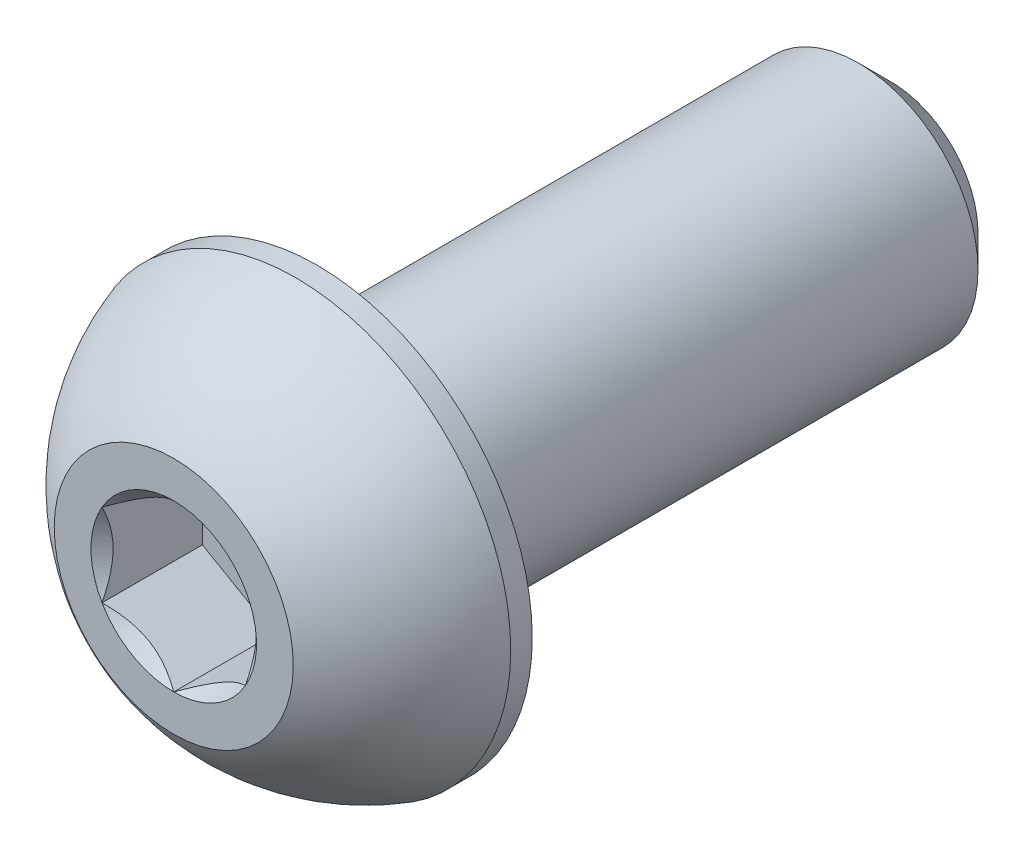
ISO-10303-21;
HEADER;
FILE_DESCRIPTION(('STEP AP214'),'2;1');
FILE_NAME('part.step','',(''),(''),'','','');
FILE_SCHEMA(('AUTOMOTIVE_DESIGN { 1 0 10303 214 1 1 1 1 }'));
ENDSEC;
DATA;
#1=APPLICATION_CONTEXT('core data for automotive mechanical design processes');
#2=APPLICATION_PROTOCOL_DEFINITION('international standard','automotive_design',2000,#1);
#3=PRODUCT_CONTEXT('',#1,'mechanical');
#4=PRODUCT('Part','Part','',(#3));
#5=PRODUCT_RELATED_PRODUCT_CATEGORY('part','',(#4));
#6=PRODUCT_DEFINITION_FORMATION('','',#4);
#7=PRODUCT_DEFINITION_CONTEXT('part definition',#1,'design');
#8=PRODUCT_DEFINITION('design','',#6,#7);
#9=PRODUCT_DEFINITION_SHAPE('','',#8);
#10=(LENGTH_UNIT() NAMED_UNIT(*) SI_UNIT(.MILLI.,.METRE.));
#11=(NAMED_UNIT(*) PLANE_ANGLE_UNIT() SI_UNIT($,.RADIAN.));
#12=(NAMED_UNIT(*) SI_UNIT($,.STERADIAN.) SOLID_ANGLE_UNIT());
#13=UNCERTAINTY_MEASURE_WITH_UNIT(LENGTH_MEASURE(1.E-05),#10,'distance_accuracy_value','');
#14=(GEOMETRIC_REPRESENTATION_CONTEXT(3) GLOBAL_UNCERTAINTY_ASSIGNED_CONTEXT((#13)) GLOBAL_UNIT_ASSIGNED_CONTEXT((#10,
#11,#12)) REPRESENTATION_CONTEXT('',''));
#15=CARTESIAN_POINT('',(0.,0.,0.));
#16=DIRECTION('',(0.,0.,1.));
#17=DIRECTION('',(1.,0.,0.));
#18=AXIS2_PLACEMENT_3D('',#15,#16,#17);
#19=CARTESIAN_POINT('',(0.,0.,-3.));
#20=DIRECTION('',(0.,0.,1.));
#21=DIRECTION('',(0.,-1.,0.));
#22=AXIS2_PLACEMENT_3D('',#19,#20,#21);
#23=PLANE('',#22);
#24=CARTESIAN_POINT('',(0.,0.,-3.));
#25=DIRECTION('',(0.,0.,1.));
#26=DIRECTION('',(0.,-1.,0.));
#27=AXIS2_PLACEMENT_3D('',#24,#25,#26);
#28=CIRCLE('',#27,0.912499999999999);
#29=CARTESIAN_POINT('',(0.,-0.9125,-3.));
#30=VERTEX_POINT('',#29);
#31=EDGE_CURVE('E54',#30,#30,#28,.T.);
#32=ORIENTED_EDGE('',*,*,#31,.F.);
#33=EDGE_LOOP('',(#32));
#34=FACE_BOUND('',#33,.T.);
#35=ADVANCED_FACE('F41',(#34),#23,.F.);
#36=CARTESIAN_POINT('',(0.,0.,-3.));
#37=DIRECTION('',(0.,0.,1.));
#38=DIRECTION('',(0.,-1.,0.));
#39=AXIS2_PLACEMENT_3D('',#36,#37,#38);
#40=CONICAL_SURFACE('',#39,0.912499999999999,0.785398163397446);
#41=CARTESIAN_POINT('',(0.,0.,-2.6625));
#42=DIRECTION('',(0.,0.,1.));
#43=DIRECTION('',(0.,-1.,0.));
#44=AXIS2_PLACEMENT_3D('',#41,#42,#43);
#45=CIRCLE('',#44,1.25);
#46=CARTESIAN_POINT('',(0.,-1.25,-2.6625));
#47=VERTEX_POINT('',#46);
#48=EDGE_CURVE('E185',#47,#47,#45,.T.);
#49=ORIENTED_EDGE('',*,*,#48,.F.);
#50=EDGE_LOOP('',(#49));
#51=FACE_BOUND('',#50,.T.);
#52=ORIENTED_EDGE('',*,*,#31,.T.);
#53=EDGE_LOOP('',(#52));
#54=FACE_BOUND('',#53,.T.);
#55=ADVANCED_FACE('F190',(#51,#54),#40,.T.);
#56=CARTESIAN_POINT('',(0.,0.,4.5));
#57=DIRECTION('',(0.,0.,1.));
#58=DIRECTION('',(0.,-1.,0.));
#59=AXIS2_PLACEMENT_3D('',#56,#57,#58);
#60=CYLINDRICAL_SURFACE('',#59,1.25);
#61=CARTESIAN_POINT('',(0.,0.,3.));
#62=DIRECTION('',(0.,0.,1.));
#63=DIRECTION('',(0.,-1.,0.));
#64=AXIS2_PLACEMENT_3D('',#61,#62,#63);
#65=CIRCLE('',#64,1.25);
#66=CARTESIAN_POINT('',(0.,-1.25,3.));
#67=VERTEX_POINT('',#66);
#68=EDGE_CURVE('E182',#67,#67,#65,.T.);
#69=ORIENTED_EDGE('',*,*,#68,.F.);
#70=EDGE_LOOP('',(#69));
#71=FACE_BOUND('',#70,.T.);
#72=ORIENTED_EDGE('',*,*,#48,.T.);
#73=EDGE_LOOP('',(#72));
#74=FACE_BOUND('',#73,.T.);
#75=ADVANCED_FACE('F196',(#71,#74),#60,.T.);
#76=CARTESIAN_POINT('',(0.,-2.25,3.));
#77=DIRECTION('',(0.,0.,1.));
#78=DIRECTION('',(0.,-1.,0.));
#79=AXIS2_PLACEMENT_3D('',#76,#77,#78);
#80=PLANE('',#79);
#81=CARTESIAN_POINT('',(0.,0.,3.));
#82=DIRECTION('',(0.,0.,1.));
#83=DIRECTION('',(0.,-1.,0.));
#84=AXIS2_PLACEMENT_3D('',#81,#82,#83);
#85=CIRCLE('',#84,2.25);
#86=CARTESIAN_POINT('',(0.,-2.25,3.));
#87=VERTEX_POINT('',#86);
#88=EDGE_CURVE('E176',#87,#87,#85,.T.);
#89=ORIENTED_EDGE('',*,*,#88,.F.);
#90=EDGE_LOOP('',(#89));
#91=FACE_BOUND('',#90,.T.);
#92=ORIENTED_EDGE('',*,*,#68,.T.);
#93=EDGE_LOOP('',(#92));
#94=FACE_BOUND('',#93,.T.);
#95=ADVANCED_FACE('F201',(#91,#94),#80,.F.);
#96=CARTESIAN_POINT('',(0.,0.,2.48995098039216));
#97=DIRECTION('',(0.,0.,1.));
#98=DIRECTION('',(0.,-1.,0.));
#99=AXIS2_PLACEMENT_3D('',#96,#97,#98);
#100=SPHERICAL_SURFACE('',#99,2.36702282651149);
#101=CARTESIAN_POINT('',(0.,0.,4.5));
#102=DIRECTION('',(0.,0.,1.));
#103=DIRECTION('',(0.,-1.,0.));
#104=AXIS2_PLACEMENT_3D('',#101,#102,#103);
#105=CIRCLE('',#104,1.25);
#106=CARTESIAN_POINT('',(0.,-1.25,4.5));
#107=VERTEX_POINT('',#106);
#108=EDGE_CURVE('E179',#107,#107,#105,.T.);
#109=CARTESIAN_POINT('',(0.,0.,3.225));
#110=DIRECTION('',(0.,0.,1.));
#111=DIRECTION('',(0.,-1.,0.));
#112=AXIS2_PLACEMENT_3D('',#109,#110,#111);
#113=CIRCLE('',#112,2.25);
#114=CARTESIAN_POINT('',(0.,-2.25,3.225));
#115=VERTEX_POINT('',#114);
#116=EDGE_CURVE('E173',#115,#115,#113,.T.);
#117=CARTESIAN_POINT('',(0.,-1.25,4.5));
#118=CARTESIAN_POINT('',(0.,-1.26462917100962,4.49090251661049));
#119=CARTESIAN_POINT('',(0.,-1.27915898996254,4.48164527352318));
#120=CARTESIAN_POINT('',(0.,-1.30801307458842,4.46281579935833));
#121=CARTESIAN_POINT('',(0.,-1.32233734026139,4.45324356828078));
#122=CARTESIAN_POINT('',(0.,-1.35077346916084,4.43378864954077));
#123=CARTESIAN_POINT('',(0.,-1.36488533238733,4.4239059618783));
#124=CARTESIAN_POINT('',(0.,-1.39288993473665,4.40383484960456));
#125=CARTESIAN_POINT('',(0.,-1.40678267385948,4.39364642499327));
#126=CARTESIAN_POINT('',(0.,-1.43434240376681,4.37296869342377));
#127=CARTESIAN_POINT('',(0.,-1.44800939455129,4.36247938646554));
#128=CARTESIAN_POINT('',(0.,-1.47511111304782,4.34120489112507));
#129=CARTESIAN_POINT('',(0.,-1.48854584075986,4.33041970274282));
#130=CARTESIAN_POINT('',(0.,-1.51517662859343,4.30855858575153));
#131=CARTESIAN_POINT('',(0.,-1.52837268871496,4.29748265714249));
#132=CARTESIAN_POINT('',(0.,-1.55451985075898,4.27504533969981));
#133=CARTESIAN_POINT('',(0.,-1.56747095268147,4.26368395086616));
#134=CARTESIAN_POINT('',(0.,-1.59312202445558,4.24068112900137));
#135=CARTESIAN_POINT('',(0.,-1.60582199430721,4.22903969597022));
#136=CARTESIAN_POINT('',(0.,-1.6309647477936,4.2054823352511));
#137=CARTESIAN_POINT('',(0.,-1.64340753142836,4.19356640756313));
#138=CARTESIAN_POINT('',(0.,-1.66802998093452,4.16946573792022));
#139=CARTESIAN_POINT('',(0.,-1.68020964680593,4.15728099596527));
#140=CARTESIAN_POINT('',(0.,-1.70430005466935,4.13264850632462));
#141=CARTESIAN_POINT('',(0.,-1.71621079666137,4.12020075863892));
#142=CARTESIAN_POINT('',(0.,-1.73975767884732,4.09504819144901));
#143=CARTESIAN_POINT('',(0.,-1.75139381904126,4.0823433719448));
#144=CARTESIAN_POINT('',(0.,-1.77438595061668,4.05668271757783));
#145=CARTESIAN_POINT('',(0.,-1.78574194199815,4.04372688271506));
#146=CARTESIAN_POINT('',(0.,-1.80816836248277,4.01757037375133));
#147=CARTESIAN_POINT('',(0.,-1.81923879158591,4.00436969965038));
#148=CARTESIAN_POINT('',(0.,-1.84108881017717,3.97772980504691));
#149=CARTESIAN_POINT('',(0.,-1.85186839966529,3.9642905845444));
#150=CARTESIAN_POINT('',(0.,-1.87313160033471,3.93718000369089));
#151=CARTESIAN_POINT('',(0.,-1.88361521151601,3.9235086433399));
#152=CARTESIAN_POINT('',(0.,-1.90428145797454,3.89594030000488));
#153=CARTESIAN_POINT('',(0.,-1.91446409325177,3.88204331702085));
#154=CARTESIAN_POINT('',(0.,-1.93452353378186,3.85403035319083));
#155=CARTESIAN_POINT('',(0.,-1.94440033903471,3.83991437234483));
#156=CARTESIAN_POINT('',(0.,-1.96384341118664,3.81147014195944));
#157=CARTESIAN_POINT('',(0.,-1.97340967808572,3.79714189242005));
#158=CARTESIAN_POINT('',(0.,-1.99222711323609,3.76827995500615));
#159=CARTESIAN_POINT('',(0.,-2.00147828148738,3.75374626713164));
#160=CARTESIAN_POINT('',(0.,-2.01966110925757,3.72448038133943));
#161=CARTESIAN_POINT('',(0.,-2.02859276877647,3.70974818342174));
#162=CARTESIAN_POINT('',(0.,-2.04613232130859,3.68009230046584));
#163=CARTESIAN_POINT('',(0.,-2.0547402143218,3.66516861542764));
#164=CARTESIAN_POINT('',(0.,-2.07162813041181,3.63513687243686));
#165=CARTESIAN_POINT('',(0.,-2.0799081534886,3.62002881448427));
#166=CARTESIAN_POINT('',(0.,-2.09613638256798,3.58963552776085));
#167=CARTESIAN_POINT('',(0.,-2.10408458857057,3.57435029899003));
#168=CARTESIAN_POINT('',(0.,-2.11964539455964,3.54360995719053));
#169=CARTESIAN_POINT('',(0.,-2.12725799454612,3.52815484416185));
#170=CARTESIAN_POINT('',(0.,-2.14214395948377,3.49708210136983));
#171=CARTESIAN_POINT('',(0.,-2.14941732443493,3.4814644716065));
#172=CARTESIAN_POINT('',(0.,-2.16362135223167,3.45007414042306));
#173=CARTESIAN_POINT('',(0.,-2.17055201507725,3.43430143900295));
#174=CARTESIAN_POINT('',(0.,-2.18406733408852,3.40260848320124));
#175=CARTESIAN_POINT('',(0.,-2.19065199025422,3.38668822881965));
#176=CARTESIAN_POINT('',(0.,-2.20347215952944,3.3547077572721));
#177=CARTESIAN_POINT('',(0.,-2.20970767263897,3.33864754010615));
#178=CARTESIAN_POINT('',(0.,-2.2218265737175,3.30639479562423));
#179=CARTESIAN_POINT('',(0.,-2.2277099616865,3.29020226830828));
#180=CARTESIAN_POINT('',(0.,-2.23912184359131,3.2576926351465));
#181=CARTESIAN_POINT('',(0.,-2.24465033752712,3.24137552930068));
#182=CARTESIAN_POINT('',(0.,-2.25,3.225));
#183=B_SPLINE_CURVE_WITH_KNOTS('',3,(#117,#118,#119,#120,#121,#122,#123,#124,#125,#126,#127,
#128,#129,#130,#131,#132,#133,#134,#135,#136,#137,#138,#139,#140,#141,#142,#143,#144,#145,#146,
#147,#148,#149,#150,#151,#152,#153,#154,#155,#156,#157,#158,#159,#160,#161,#162,#163,#164,#165,
#166,#167,#168,#169,#170,#171,#172,#173,#174,#175,#176,#177,#178,#179,#180,#181,#182),
.UNSPECIFIED.,.F.,.F.,(4,2,2,2,2,2,2,2,2,2,2,2,2,2,2,2,2,2,2,2,2,2,2,2,2,2,2,2,2,2,2,2,4),(0.,
0.0516806087027549,0.10336121740551,0.155041826108264,0.206722434811019,0.258403043513774,
0.310083652216529,0.361764260919283,0.413444869622038,0.465125478324793,0.516806087027547,
0.568486695730302,0.620167304433057,0.671847913135812,0.723528521838566,0.775209130541321,
0.826889739244076,0.87857034794683,0.930250956649585,0.981931565352339,1.03361217405509,
1.08529278275785,1.1369733914606,1.18865400016336,1.24033460886611,1.29201521756887,
1.34369582627162,1.39537643497438,1.44705704367713,1.49873765237989,1.55041826108264,
1.6020988697854,1.65377947848815),.UNSPECIFIED.);
#184=EDGE_CURVE('BSEAM206',#107,#115,#183,.T.);
#185=ORIENTED_EDGE('',*,*,#108,.F.);
#186=ORIENTED_EDGE('',*,*,#116,.T.);
#187=ORIENTED_EDGE('',*,*,#184,.T.);
#188=ORIENTED_EDGE('',*,*,#184,.F.);
#189=EDGE_LOOP('',(#185,#187,#186,#188));
#190=FACE_BOUND('',#189,.T.);
#191=ADVANCED_FACE('F206',(#190),#100,.T.);
#192=CARTESIAN_POINT('',(0.,-1.25,4.5));
#193=DIRECTION('',(0.,0.,-1.));
#194=DIRECTION('',(0.,1.,0.));
#195=AXIS2_PLACEMENT_3D('',#192,#193,#194);
#196=PLANE('',#195);
#197=CARTESIAN_POINT('',(0.,0.,4.5));
#198=DIRECTION('',(0.,0.,1.));
#199=DIRECTION('',(1.,0.,0.));
#200=AXIS2_PLACEMENT_3D('',#197,#198,#199);
#201=CIRCLE('',#200,0.866025403784438);
#202=CARTESIAN_POINT('',(0.,0.866025403784437,4.5));
#203=VERTEX_POINT('',#202);
#204=CARTESIAN_POINT('',(-0.75,0.433012701892217,4.5));
#205=VERTEX_POINT('',#204);
#206=EDGE_CURVE('E140',#203,#205,#201,.T.);
#207=ORIENTED_EDGE('',*,*,#206,.F.);
#208=CARTESIAN_POINT('',(0.75,0.433012701892218,4.5));
#209=VERTEX_POINT('',#208);
#210=EDGE_CURVE('E137',#209,#203,#201,.T.);
#211=ORIENTED_EDGE('',*,*,#210,.F.);
#212=CARTESIAN_POINT('',(0.75,-0.43301270189222,4.5));
#213=VERTEX_POINT('',#212);
#214=EDGE_CURVE('E107',#213,#209,#201,.T.);
#215=ORIENTED_EDGE('',*,*,#214,.F.);
#216=CARTESIAN_POINT('',(0.,-0.866025403784439,4.5));
#217=VERTEX_POINT('',#216);
#218=EDGE_CURVE('E99',#217,#213,#201,.T.);
#219=ORIENTED_EDGE('',*,*,#218,.F.);
#220=CARTESIAN_POINT('',(-0.749999999999999,-0.43301270189222,4.5));
#221=VERTEX_POINT('',#220);
#222=EDGE_CURVE('E60',#221,#217,#201,.T.);
#223=ORIENTED_EDGE('',*,*,#222,.F.);
#224=EDGE_CURVE('E67',#205,#221,#201,.T.);
#225=ORIENTED_EDGE('',*,*,#224,.F.);
#226=EDGE_LOOP('',(#207,#211,#215,#219,#223,#225));
#227=FACE_BOUND('',#226,.T.);
#228=ORIENTED_EDGE('',*,*,#108,.T.);
#229=EDGE_LOOP('',(#228));
#230=FACE_BOUND('',#229,.T.);
#231=ADVANCED_FACE('F134',(#227,#230),#196,.F.);
#232=CARTESIAN_POINT('',(0.,0.,4.5));
#233=DIRECTION('',(0.,0.,1.));
#234=DIRECTION('',(0.,-1.,0.));
#235=AXIS2_PLACEMENT_3D('',#232,#233,#234);
#236=CYLINDRICAL_SURFACE('',#235,2.25);
#237=ORIENTED_EDGE('',*,*,#116,.F.);
#238=EDGE_LOOP('',(#237));
#239=FACE_BOUND('',#238,.T.);
#240=ORIENTED_EDGE('',*,*,#88,.T.);
#241=EDGE_LOOP('',(#240));
#242=FACE_BOUND('',#241,.T.);
#243=ADVANCED_FACE('F212',(#239,#242),#236,.T.);
#244=CARTESIAN_POINT('',(0.,0.,4.5));
#245=DIRECTION('',(0.,0.,1.));
#246=DIRECTION('',(1.,0.,0.));
#247=AXIS2_PLACEMENT_3D('',#244,#245,#246);
#248=CONICAL_SURFACE('',#247,0.866025403784438,0.78539816339745);
#249=ORIENTED_EDGE('',*,*,#214,.T.);
#250=CARTESIAN_POINT('',(0.75,-0.863604064848464,4.7777892581354));
#251=CARTESIAN_POINT('',(0.75,-0.842575879734334,4.76191493200841));
#252=CARTESIAN_POINT('',(0.75,-0.821430496291562,4.746196265183));
#253=CARTESIAN_POINT('',(0.75,-0.77885785741902,4.71513452062663));
#254=CARTESIAN_POINT('',(0.75,-0.757430533042237,4.69979153749355));
#255=CARTESIAN_POINT('',(0.75,-0.692340710712937,4.65420358029367));
#256=CARTESIAN_POINT('',(0.75,-0.648190081053414,4.62464409174343));
#257=CARTESIAN_POINT('',(0.75,-0.55560718150175,4.5666155826928));
#258=CARTESIAN_POINT('',(0.75,-0.507074363017997,4.5383051093658));
#259=CARTESIAN_POINT('',(0.75,-0.407587529772338,4.48651811176889));
#260=CARTESIAN_POINT('',(0.75,-0.356642419548471,4.46302529153185));
#261=CARTESIAN_POINT('',(0.75,-0.280165468820771,4.43428689950068));
#262=CARTESIAN_POINT('',(0.75,-0.255770023930572,4.42603927481306));
#263=CARTESIAN_POINT('',(0.75,-0.206403277885132,4.41149717542019));
#264=CARTESIAN_POINT('',(0.75,-0.181431937185907,4.40520283526912));
#265=CARTESIAN_POINT('',(0.75,-0.106699879404925,4.3899931738806));
#266=CARTESIAN_POINT('',(0.75,-0.0561907171762179,4.3843771847129));
#267=CARTESIAN_POINT('',(0.75,0.0430767231749057,4.38362825645435));
#268=CARTESIAN_POINT('',(0.75,0.0918322434166279,4.38812345140561));
#269=CARTESIAN_POINT('',(0.75,0.164112195698294,4.40133730744598));
#270=CARTESIAN_POINT('',(0.75,0.188278676879436,4.40690144638208));
#271=CARTESIAN_POINT('',(0.75,0.23609448012033,4.41992316614873));
#272=CARTESIAN_POINT('',(0.75,0.25974384527304,4.42738058854766));
#273=CARTESIAN_POINT('',(0.75,0.334198278463818,4.45366646946609));
#274=CARTESIAN_POINT('',(0.75,0.383940060445494,4.47549033804845));
#275=CARTESIAN_POINT('',(0.75,0.481089225076665,4.52401180410059));
#276=CARTESIAN_POINT('',(0.75,0.528487417973016,4.55072691131035));
#277=CARTESIAN_POINT('',(0.75,0.619071540465249,4.60584285115078));
#278=CARTESIAN_POINT('',(0.75,0.662349745300237,4.63409394545219));
#279=CARTESIAN_POINT('',(0.75,0.726111623216223,4.6777671470975));
#280=CARTESIAN_POINT('',(0.75,0.747090419255278,4.6924788605167));
#281=CARTESIAN_POINT('',(0.75,0.788761341501859,4.7222913841024));
#282=CARTESIAN_POINT('',(0.75,0.809453544535618,4.73739208676303));
#283=CARTESIAN_POINT('',(0.75,0.830026390097468,4.75265408930473));
#284=B_SPLINE_CURVE_WITH_KNOTS('',3,(#250,#251,#252,#253,#254,#255,#256,#257,#258,#259,#260,
#261,#262,#263,#264,#265,#266,#267,#268,#269,#270,#271,#272,#273,#274,#275,#276,#277,#278,#279,
#280,#281,#282,#283),.UNSPECIFIED.,.F.,.F.,(4,2,2,2,2,2,2,2,2,2,2,2,2,2,2,2,4),(0.,
0.0790398443124677,0.158099390497593,0.317425208674102,0.485845155681378,0.653685658303958,
0.730869805636066,0.808059268704009,0.959469653380781,1.10540290447489,1.17973203111653,
1.25405493988072,1.41653726506054,1.57961304287543,1.73458511695816,1.81145152932467,
1.88829692115811),.UNSPECIFIED.);
#285=EDGE_CURVE('E11',#213,#209,#284,.T.);
#286=ORIENTED_EDGE('',*,*,#285,.F.);
#287=EDGE_LOOP('',(#249,#286));
#288=FACE_BOUND('',#287,.T.);
#289=ADVANCED_FACE('F111',(#288),#248,.F.);
#290=ORIENTED_EDGE('',*,*,#210,.T.);
#291=CARTESIAN_POINT('',(0.7502,0.43289723183838,4.50011549314477));
#292=CARTESIAN_POINT('',(0.724410037442318,0.447787073663448,4.48523411046392));
#293=CARTESIAN_POINT('',(0.69818879787134,0.462925913388237,4.47122626560696));
#294=CARTESIAN_POINT('',(0.644720291764293,0.493795969782308,4.44557752468226));
#295=CARTESIAN_POINT('',(0.617467932539427,0.509530126716837,4.43395091170567));
#296=CARTESIAN_POINT('',(0.562514649618646,0.541257419404003,4.41403404577224));
#297=CARTESIAN_POINT('',(0.53482774330449,0.557242462217509,4.40569369408137));
#298=CARTESIAN_POINT('',(0.478844404869146,0.589564457733289,4.39284274196143));
#299=CARTESIAN_POINT('',(0.450549685156354,0.605900421776114,4.38832254058884));
#300=CARTESIAN_POINT('',(0.401789710731156,0.634052006136182,4.38424583309744));
#301=CARTESIAN_POINT('',(0.381387934344427,0.645830977225007,4.38364279661408));
#302=CARTESIAN_POINT('',(0.34062386530364,0.66936612345897,4.38465450601553));
#303=CARTESIAN_POINT('',(0.320261582348545,0.681122293004409,4.38626974099003));
#304=CARTESIAN_POINT('',(0.259465456913176,0.716222952390205,4.39433614697304));
#305=CARTESIAN_POINT('',(0.219334145003901,0.739392776123958,4.40400893582772));
#306=CARTESIAN_POINT('',(0.148889599645974,0.780063953349298,4.42735631797231));
#307=CARTESIAN_POINT('',(0.118246427990914,0.797755796753171,4.43980855807225));
#308=CARTESIAN_POINT('',(0.0581606541952102,0.832446334428587,4.46785961023086));
#309=CARTESIAN_POINT('',(0.0287145116184091,0.8494470727719,4.48344818590375));
#310=CARTESIAN_POINT('',(-0.000200000000000146,0.866140873838275,4.50011549314477));
#311=B_SPLINE_CURVE_WITH_KNOTS('',3,(#291,#292,#293,#294,#295,#296,#297,#298,#299,#300,#301,
#302,#303,#304,#305,#306,#307,#308,#309,#310),.UNSPECIFIED.,.F.,.F.,(4,2,2,2,2,2,2,2,2,4),(0.,
0.0999419466095595,0.200466857654446,0.299393763705718,0.39807129730023,0.468665775681748,
0.539275821398839,0.680536257244566,0.792918418368073,0.904939568716031),.UNSPECIFIED.);
#312=EDGE_CURVE('E139',#209,#203,#311,.T.);
#313=ORIENTED_EDGE('',*,*,#312,.F.);
#314=EDGE_LOOP('',(#290,#313));
#315=FACE_BOUND('',#314,.T.);
#316=ADVANCED_FACE('F291',(#315),#248,.F.);
#317=ORIENTED_EDGE('',*,*,#206,.T.);
#318=CARTESIAN_POINT('',(0.000200000000000006,0.866140873838275,4.50011549314477));
#319=CARTESIAN_POINT('',(-0.0255899625576814,0.851251032013207,4.48523411046392));
#320=CARTESIAN_POINT('',(-0.051811202128659,0.836112192288417,4.47122626560696));
#321=CARTESIAN_POINT('',(-0.105279708235706,0.805242135894346,4.44557752468226));
#322=CARTESIAN_POINT('',(-0.132532067460573,0.789507978959817,4.43395091170567));
#323=CARTESIAN_POINT('',(-0.187485350381353,0.757780686272651,4.41403404577224));
#324=CARTESIAN_POINT('',(-0.215172256695509,0.741795643459145,4.40569369408137));
#325=CARTESIAN_POINT('',(-0.271155595130853,0.709473647943366,4.39284274196143));
#326=CARTESIAN_POINT('',(-0.299450314843645,0.69313768390054,4.38832254058884));
#327=CARTESIAN_POINT('',(-0.348210289268843,0.664986099540472,4.38424583309744));
#328=CARTESIAN_POINT('',(-0.368612065655572,0.653207128451648,4.38364279661408));
#329=CARTESIAN_POINT('',(-0.40937613469636,0.629671982217685,4.38465450601553));
#330=CARTESIAN_POINT('',(-0.429738417651455,0.617915812672245,4.38626974099003));
#331=CARTESIAN_POINT('',(-0.490534543086823,0.582815153286449,4.39433614697304));
#332=CARTESIAN_POINT('',(-0.530665854996099,0.559645329552696,4.40400893582772));
#333=CARTESIAN_POINT('',(-0.601110400354025,0.518974152327356,4.42735631797231));
#334=CARTESIAN_POINT('',(-0.631753572009086,0.501282308923483,4.43980855807225));
#335=CARTESIAN_POINT('',(-0.691839345804789,0.466591771248067,4.46785961023086));
#336=CARTESIAN_POINT('',(-0.72128548838159,0.449591032904755,4.48344818590375));
#337=CARTESIAN_POINT('',(-0.750199999999999,0.43289723183838,4.50011549314477));
#338=B_SPLINE_CURVE_WITH_KNOTS('',3,(#318,#319,#320,#321,#322,#323,#324,#325,#326,#327,#328,
#329,#330,#331,#332,#333,#334,#335,#336,#337),.UNSPECIFIED.,.F.,.F.,(4,2,2,2,2,2,2,2,2,4),(0.,
0.0999419466095594,0.200466857654446,0.299393763705717,0.39807129730023,0.468665775681748,
0.539275821398839,0.680536257244566,0.792918418368073,0.904939568716031),.UNSPECIFIED.);
#339=EDGE_CURVE('E143',#203,#205,#338,.T.);
#340=ORIENTED_EDGE('',*,*,#339,.F.);
#341=EDGE_LOOP('',(#317,#340));
#342=FACE_BOUND('',#341,.T.);
#343=ADVANCED_FACE('F146',(#342),#248,.F.);
#344=ORIENTED_EDGE('',*,*,#224,.T.);
#345=CARTESIAN_POINT('',(-0.749999999999999,-0.863604064848464,4.7777892581354));
#346=CARTESIAN_POINT('',(-0.749999999999999,-0.842575879734334,4.76191493200841));
#347=CARTESIAN_POINT('',(-0.749999999999999,-0.821430496291562,4.746196265183));
#348=CARTESIAN_POINT('',(-0.749999999999999,-0.778857857419021,4.71513452062663));
#349=CARTESIAN_POINT('',(-0.749999999999999,-0.757430533042238,4.69979153749355));
#350=CARTESIAN_POINT('',(-0.749999999999999,-0.692340710712937,4.65420358029367));
#351=CARTESIAN_POINT('',(-0.749999999999999,-0.648190081053414,4.62464409174343));
#352=CARTESIAN_POINT('',(-0.749999999999999,-0.555607181501751,4.5666155826928));
#353=CARTESIAN_POINT('',(-0.749999999999999,-0.507074363017997,4.53830510936579));
#354=CARTESIAN_POINT('',(-0.749999999999999,-0.407587529772338,4.48651811176889));
#355=CARTESIAN_POINT('',(-0.749999999999999,-0.356642419548472,4.46302529153185));
#356=CARTESIAN_POINT('',(-0.749999999999999,-0.280165468820772,4.43428689950068));
#357=CARTESIAN_POINT('',(-0.749999999999999,-0.255770023930573,4.42603927481306));
#358=CARTESIAN_POINT('',(-0.749999999999999,-0.206403277885132,4.41149717542019));
#359=CARTESIAN_POINT('',(-0.749999999999999,-0.181431937185908,4.40520283526912));
#360=CARTESIAN_POINT('',(-0.749999999999999,-0.106699879404925,4.3899931738806));
#361=CARTESIAN_POINT('',(-0.749999999999999,-0.0561907171762184,4.3843771847129));
#362=CARTESIAN_POINT('',(-0.749999999999999,0.0430767231749052,4.38362825645435));
#363=CARTESIAN_POINT('',(-0.749999999999999,0.0918322434166273,4.38812345140561));
#364=CARTESIAN_POINT('',(-0.749999999999999,0.164112195698293,4.40133730744598));
#365=CARTESIAN_POINT('',(-0.749999999999999,0.188278676879436,4.40690144638208));
#366=CARTESIAN_POINT('',(-0.749999999999999,0.23609448012033,4.41992316614873));
#367=CARTESIAN_POINT('',(-0.749999999999999,0.25974384527304,4.42738058854766));
#368=CARTESIAN_POINT('',(-0.749999999999999,0.334198278463818,4.45366646946609));
#369=CARTESIAN_POINT('',(-0.749999999999999,0.383940060445494,4.47549033804844));
#370=CARTESIAN_POINT('',(-0.749999999999999,0.481089225076664,4.52401180410059));
#371=CARTESIAN_POINT('',(-0.749999999999999,0.528487417973015,4.55072691131035));
#372=CARTESIAN_POINT('',(-0.749999999999999,0.619071540465249,4.60584285115078));
#373=CARTESIAN_POINT('',(-0.749999999999999,0.662349745300237,4.63409394545219));
#374=CARTESIAN_POINT('',(-0.749999999999999,0.726111623216223,4.6777671470975));
#375=CARTESIAN_POINT('',(-0.749999999999999,0.747090419255278,4.6924788605167));
#376=CARTESIAN_POINT('',(-0.749999999999999,0.788761341501858,4.7222913841024));
#377=CARTESIAN_POINT('',(-0.749999999999999,0.809453544535618,4.73739208676303));
#378=CARTESIAN_POINT('',(-0.749999999999999,0.830026390097467,4.75265408930473));
#379=B_SPLINE_CURVE_WITH_KNOTS('',3,(#345,#346,#347,#348,#349,#350,#351,#352,#353,#354,#355,
#356,#357,#358,#359,#360,#361,#362,#363,#364,#365,#366,#367,#368,#369,#370,#371,#372,#373,#374,
#375,#376,#377,#378),.UNSPECIFIED.,.F.,.F.,(4,2,2,2,2,2,2,2,2,2,2,2,2,2,2,2,4),(0.,
0.0790398443124676,0.158099390497593,0.317425208674102,0.485845155681378,0.653685658303958,
0.730869805636066,0.808059268704009,0.959469653380781,1.10540290447489,1.17973203111653,
1.25405493988072,1.41653726506054,1.57961304287543,1.73458511695816,1.81145152932467,
1.8882969211581),.UNSPECIFIED.);
#380=EDGE_CURVE('E149',#205,#221,#379,.F.);
#381=ORIENTED_EDGE('',*,*,#380,.F.);
#382=EDGE_LOOP('',(#344,#381));
#383=FACE_BOUND('',#382,.T.);
#384=ADVANCED_FACE('F150',(#383),#248,.F.);
#385=ORIENTED_EDGE('',*,*,#222,.T.);
#386=CARTESIAN_POINT('',(-0.750199999999999,-0.432897231838383,4.50011549314477));
#387=CARTESIAN_POINT('',(-0.724410037442318,-0.44778707366345,4.48523411046393));
#388=CARTESIAN_POINT('',(-0.69818879787134,-0.46292591338824,4.47122626560696));
#389=CARTESIAN_POINT('',(-0.644720291764293,-0.493795969782311,4.44557752468226));
#390=CARTESIAN_POINT('',(-0.617467932539427,-0.50953012671684,4.43395091170567));
#391=CARTESIAN_POINT('',(-0.562514649618647,-0.541257419404006,4.41403404577225));
#392=CARTESIAN_POINT('',(-0.534827743304491,-0.557242462217512,4.40569369408137));
#393=CARTESIAN_POINT('',(-0.478844404869147,-0.589564457733291,4.39284274196143));
#394=CARTESIAN_POINT('',(-0.450549685156355,-0.605900421776117,4.38832254058884));
#395=CARTESIAN_POINT('',(-0.401789710731157,-0.634052006136184,4.38424583309744));
#396=CARTESIAN_POINT('',(-0.381387934344428,-0.645830977225009,4.38364279661408));
#397=CARTESIAN_POINT('',(-0.34062386530364,-0.669366123458972,4.38465450601553));
#398=CARTESIAN_POINT('',(-0.320261582348545,-0.681122293004412,4.38626974099004));
#399=CARTESIAN_POINT('',(-0.259465456913177,-0.716222952390208,4.39433614697304));
#400=CARTESIAN_POINT('',(-0.219334145003901,-0.739392776123961,4.40400893582772));
#401=CARTESIAN_POINT('',(-0.148889599645975,-0.780063953349301,4.42735631797232));
#402=CARTESIAN_POINT('',(-0.118246427990914,-0.797755796753174,4.43980855807225));
#403=CARTESIAN_POINT('',(-0.0581606541952105,-0.83244633442859,4.46785961023086));
#404=CARTESIAN_POINT('',(-0.0287145116184095,-0.849447072771902,4.48344818590375));
#405=CARTESIAN_POINT('',(0.000199999999999996,-0.866140873838277,4.50011549314477));
#406=B_SPLINE_CURVE_WITH_KNOTS('',3,(#386,#387,#388,#389,#390,#391,#392,#393,#394,#395,#396,
#397,#398,#399,#400,#401,#402,#403,#404,#405),.UNSPECIFIED.,.F.,.F.,(4,2,2,2,2,2,2,2,2,4),(0.,
0.0999419466095591,0.200466857654446,0.299393763705716,0.398071297300229,0.468665775681746,
0.539275821398838,0.680536257244565,0.792918418368073,0.904939568716031),.UNSPECIFIED.);
#407=EDGE_CURVE('E123',#221,#217,#406,.T.);
#408=ORIENTED_EDGE('',*,*,#407,.F.);
#409=EDGE_LOOP('',(#385,#408));
#410=FACE_BOUND('',#409,.T.);
#411=ADVANCED_FACE('F240',(#410),#248,.F.);
#412=ORIENTED_EDGE('',*,*,#218,.T.);
#413=CARTESIAN_POINT('',(-0.00020000000000007,-0.866140873838277,4.50011549314477));
#414=CARTESIAN_POINT('',(0.0255899625576813,-0.85125103201321,4.48523411046393));
#415=CARTESIAN_POINT('',(0.051811202128659,-0.83611219228842,4.47122626560696));
#416=CARTESIAN_POINT('',(0.105279708235706,-0.805242135894349,4.44557752468226));
#417=CARTESIAN_POINT('',(0.132532067460572,-0.78950797895982,4.43395091170567));
#418=CARTESIAN_POINT('',(0.187485350381353,-0.757780686272654,4.41403404577225));
#419=CARTESIAN_POINT('',(0.215172256695509,-0.741795643459148,4.40569369408137));
#420=CARTESIAN_POINT('',(0.271155595130853,-0.709473647943369,4.39284274196143));
#421=CARTESIAN_POINT('',(0.299450314843644,-0.693137683900543,4.38832254058884));
#422=CARTESIAN_POINT('',(0.348210289268843,-0.664986099540476,4.38424583309744));
#423=CARTESIAN_POINT('',(0.368612065655572,-0.653207128451651,4.38364279661408));
#424=CARTESIAN_POINT('',(0.409376134696359,-0.629671982217688,4.38465450601553));
#425=CARTESIAN_POINT('',(0.429738417651454,-0.617915812672248,4.38626974099004));
#426=CARTESIAN_POINT('',(0.490534543086823,-0.582815153286452,4.39433614697304));
#427=CARTESIAN_POINT('',(0.530665854996098,-0.559645329552699,4.40400893582772));
#428=CARTESIAN_POINT('',(0.601110400354025,-0.518974152327359,4.42735631797232));
#429=CARTESIAN_POINT('',(0.631753572009086,-0.501282308923486,4.43980855807225));
#430=CARTESIAN_POINT('',(0.691839345804789,-0.46659177124807,4.46785961023086));
#431=CARTESIAN_POINT('',(0.72128548838159,-0.449591032904758,4.48344818590375));
#432=CARTESIAN_POINT('',(0.7502,-0.432897231838383,4.50011549314477));
#433=B_SPLINE_CURVE_WITH_KNOTS('',3,(#413,#414,#415,#416,#417,#418,#419,#420,#421,#422,#423,
#424,#425,#426,#427,#428,#429,#430,#431,#432),.UNSPECIFIED.,.F.,.F.,(4,2,2,2,2,2,2,2,2,4),(0.,
0.0999419466095594,0.200466857654446,0.299393763705717,0.398071297300229,0.468665775681747,
0.539275821398838,0.680536257244565,0.792918418368073,0.904939568716031),.UNSPECIFIED.);
#434=EDGE_CURVE('E103',#217,#213,#433,.T.);
#435=ORIENTED_EDGE('',*,*,#434,.F.);
#436=EDGE_LOOP('',(#412,#435));
#437=FACE_BOUND('',#436,.T.);
#438=ADVANCED_FACE('F101',(#437),#248,.F.);
#439=CARTESIAN_POINT('',(0.75,-0.43301270189222,3.45));
#440=DIRECTION('',(0.,0.,1.));
#441=DIRECTION('',(1.,0.,0.));
#442=AXIS2_PLACEMENT_3D('',#439,#440,#441);
#443=PLANE('',#442);
#444=DIRECTION('',(0.866025403784439,0.5,0.));
#445=VECTOR('',#444,1.);
#446=CARTESIAN_POINT('',(0.,-0.866025403784439,3.45));
#447=LINE('',#446,#445);
#448=CARTESIAN_POINT('',(0.,-0.866025403784439,3.45));
#449=VERTEX_POINT('',#448);
#450=CARTESIAN_POINT('',(0.75,-0.43301270189222,3.45));
#451=VERTEX_POINT('',#450);
#452=EDGE_CURVE('E122',#449,#451,#447,.T.);
#453=ORIENTED_EDGE('',*,*,#452,.T.);
#454=DIRECTION('',(0.,1.,0.));
#455=VECTOR('',#454,1.);
#456=CARTESIAN_POINT('',(0.75,-0.43301270189222,3.45));
#457=LINE('',#456,#455);
#458=CARTESIAN_POINT('',(0.75,0.433012701892218,3.45));
#459=VERTEX_POINT('',#458);
#460=EDGE_CURVE('E127',#451,#459,#457,.T.);
#461=ORIENTED_EDGE('',*,*,#460,.T.);
#462=DIRECTION('',(-0.866025403784439,0.5,0.));
#463=VECTOR('',#462,1.);
#464=CARTESIAN_POINT('',(0.75,0.433012701892218,3.45));
#465=LINE('',#464,#463);
#466=CARTESIAN_POINT('',(0.,0.866025403784437,3.45));
#467=VERTEX_POINT('',#466);
#468=EDGE_CURVE('E274',#459,#467,#465,.T.);
#469=ORIENTED_EDGE('',*,*,#468,.T.);
#470=DIRECTION('',(-0.866025403784439,-0.5,0.));
#471=VECTOR('',#470,1.);
#472=CARTESIAN_POINT('',(0.,0.866025403784437,3.45));
#473=LINE('',#472,#471);
#474=CARTESIAN_POINT('',(-0.749999999999999,0.433012701892218,3.45));
#475=VERTEX_POINT('',#474);
#476=EDGE_CURVE('E276',#467,#475,#473,.T.);
#477=ORIENTED_EDGE('',*,*,#476,.T.);
#478=DIRECTION('',(0.,-1.,0.));
#479=VECTOR('',#478,1.);
#480=CARTESIAN_POINT('',(-0.749999999999999,0.433012701892218,3.45));
#481=LINE('',#480,#479);
#482=CARTESIAN_POINT('',(-0.749999999999999,-0.433012701892221,3.45));
#483=VERTEX_POINT('',#482);
#484=EDGE_CURVE('E164',#475,#483,#481,.T.);
#485=ORIENTED_EDGE('',*,*,#484,.T.);
#486=DIRECTION('',(0.866025403784439,-0.5,0.));
#487=VECTOR('',#486,1.);
#488=CARTESIAN_POINT('',(-0.749999999999999,-0.433012701892221,3.45));
#489=LINE('',#488,#487);
#490=EDGE_CURVE('E130',#483,#449,#489,.T.);
#491=ORIENTED_EDGE('',*,*,#490,.T.);
#492=EDGE_LOOP('',(#453,#461,#469,#477,#485,#491));
#493=FACE_BOUND('',#492,.T.);
#494=ADVANCED_FACE('F239',(#493),#443,.T.);
#495=CARTESIAN_POINT('',(0.75,-0.43301270189222,3.45));
#496=DIRECTION('',(1.,0.,0.));
#497=DIRECTION('',(0.,0.,-1.));
#498=AXIS2_PLACEMENT_3D('',#495,#496,#497);
#499=PLANE('',#498);
#500=DIRECTION('',(0.,0.,1.));
#501=VECTOR('',#500,1.);
#502=CARTESIAN_POINT('',(0.75,-0.43301270189222,3.45));
#503=LINE('',#502,#501);
#504=EDGE_CURVE('E119',#451,#213,#503,.T.);
#505=ORIENTED_EDGE('',*,*,#504,.T.);
#506=ORIENTED_EDGE('',*,*,#285,.T.);
#507=DIRECTION('',(0.,0.,1.));
#508=VECTOR('',#507,1.);
#509=CARTESIAN_POINT('',(0.75,0.433012701892218,3.45));
#510=LINE('',#509,#508);
#511=EDGE_CURVE('E129',#459,#209,#510,.T.);
#512=ORIENTED_EDGE('',*,*,#511,.F.);
#513=ORIENTED_EDGE('',*,*,#460,.F.);
#514=EDGE_LOOP('',(#505,#506,#512,#513));
#515=FACE_BOUND('',#514,.T.);
#516=ADVANCED_FACE('F125',(#515),#499,.F.);
#517=CARTESIAN_POINT('',(0.75,0.433012701892218,3.45));
#518=DIRECTION('',(0.5,0.866025403784439,0.));
#519=DIRECTION('',(-0.866025403784439,0.5,0.));
#520=AXIS2_PLACEMENT_3D('',#517,#518,#519);
#521=PLANE('',#520);
#522=ORIENTED_EDGE('',*,*,#511,.T.);
#523=ORIENTED_EDGE('',*,*,#312,.T.);
#524=DIRECTION('',(0.,0.,1.));
#525=VECTOR('',#524,1.);
#526=CARTESIAN_POINT('',(0.,0.866025403784437,3.45));
#527=LINE('',#526,#525);
#528=EDGE_CURVE('E160',#467,#203,#527,.T.);
#529=ORIENTED_EDGE('',*,*,#528,.F.);
#530=ORIENTED_EDGE('',*,*,#468,.F.);
#531=EDGE_LOOP('',(#522,#523,#529,#530));
#532=FACE_BOUND('',#531,.T.);
#533=ADVANCED_FACE('F265',(#532),#521,.F.);
#534=CARTESIAN_POINT('',(0.,0.866025403784437,3.45));
#535=DIRECTION('',(-0.5,0.866025403784439,0.));
#536=DIRECTION('',(-0.866025403784439,-0.5,0.));
#537=AXIS2_PLACEMENT_3D('',#534,#535,#536);
#538=PLANE('',#537);
#539=ORIENTED_EDGE('',*,*,#528,.T.);
#540=ORIENTED_EDGE('',*,*,#339,.T.);
#541=DIRECTION('',(0.,0.,1.));
#542=VECTOR('',#541,1.);
#543=CARTESIAN_POINT('',(-0.749999999999999,0.433012701892218,3.45));
#544=LINE('',#543,#542);
#545=EDGE_CURVE('E158',#475,#205,#544,.T.);
#546=ORIENTED_EDGE('',*,*,#545,.F.);
#547=ORIENTED_EDGE('',*,*,#476,.F.);
#548=EDGE_LOOP('',(#539,#540,#546,#547));
#549=FACE_BOUND('',#548,.T.);
#550=ADVANCED_FACE('F156',(#549),#538,.F.);
#551=CARTESIAN_POINT('',(-0.749999999999999,0.433012701892218,3.45));
#552=DIRECTION('',(-1.,0.,0.));
#553=DIRECTION('',(0.,-1.,0.));
#554=AXIS2_PLACEMENT_3D('',#551,#552,#553);
#555=PLANE('',#554);
#556=ORIENTED_EDGE('',*,*,#545,.T.);
#557=ORIENTED_EDGE('',*,*,#380,.T.);
#558=DIRECTION('',(0.,0.,1.));
#559=VECTOR('',#558,1.);
#560=CARTESIAN_POINT('',(-0.749999999999999,-0.433012701892221,3.45));
#561=LINE('',#560,#559);
#562=EDGE_CURVE('E166',#483,#221,#561,.T.);
#563=ORIENTED_EDGE('',*,*,#562,.F.);
#564=ORIENTED_EDGE('',*,*,#484,.F.);
#565=EDGE_LOOP('',(#556,#557,#563,#564));
#566=FACE_BOUND('',#565,.T.);
#567=ADVANCED_FACE('F162',(#566),#555,.F.);
#568=CARTESIAN_POINT('',(-0.749999999999999,-0.433012701892221,3.45));
#569=DIRECTION('',(-0.5,-0.866025403784439,0.));
#570=DIRECTION('',(0.866025403784439,-0.5,0.));
#571=AXIS2_PLACEMENT_3D('',#568,#569,#570);
#572=PLANE('',#571);
#573=ORIENTED_EDGE('',*,*,#562,.T.);
#574=ORIENTED_EDGE('',*,*,#407,.T.);
#575=DIRECTION('',(0.,0.,1.));
#576=VECTOR('',#575,1.);
#577=CARTESIAN_POINT('',(0.,-0.866025403784439,3.45));
#578=LINE('',#577,#576);
#579=EDGE_CURVE('E121',#449,#217,#578,.T.);
#580=ORIENTED_EDGE('',*,*,#579,.F.);
#581=ORIENTED_EDGE('',*,*,#490,.F.);
#582=EDGE_LOOP('',(#573,#574,#580,#581));
#583=FACE_BOUND('',#582,.T.);
#584=ADVANCED_FACE('F221',(#583),#572,.F.);
#585=CARTESIAN_POINT('',(0.,-0.866025403784439,3.45));
#586=DIRECTION('',(0.5,-0.866025403784439,0.));
#587=DIRECTION('',(0.866025403784439,0.5,0.));
#588=AXIS2_PLACEMENT_3D('',#585,#586,#587);
#589=PLANE('',#588);
#590=ORIENTED_EDGE('',*,*,#579,.T.);
#591=ORIENTED_EDGE('',*,*,#434,.T.);
#592=ORIENTED_EDGE('',*,*,#504,.F.);
#593=ORIENTED_EDGE('',*,*,#452,.F.);
#594=EDGE_LOOP('',(#590,#591,#592,#593));
#595=FACE_BOUND('',#594,.T.);
#596=ADVANCED_FACE('F117',(#595),#589,.F.);
#597=CLOSED_SHELL('',(#35,#55,#75,#95,#191,#231,#243,#289,#316,#343,#384,#411,#438,#494,#516,
#533,#550,#567,#584,#596));
#598=MANIFOLD_SOLID_BREP('B2',#597);
#599=ADVANCED_BREP_SHAPE_REPRESENTATION('',(#18,#598),#14);
#600=SHAPE_DEFINITION_REPRESENTATION(#9,#599);
ENDSEC;
END-ISO-10303-21;
